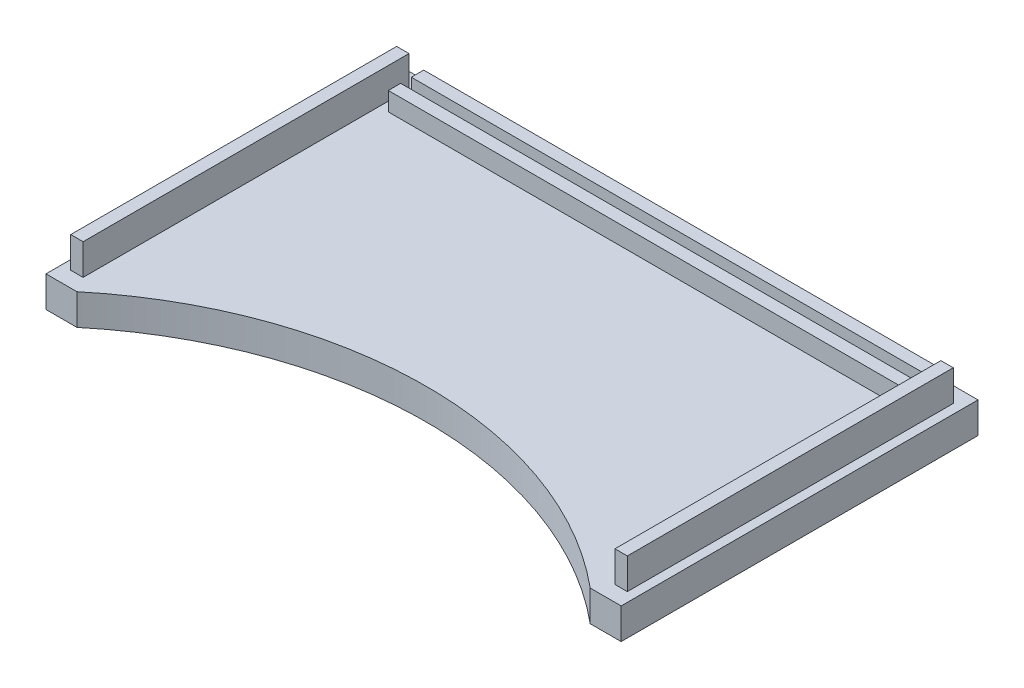
ISO-10303-21;
HEADER;
FILE_DESCRIPTION(('STEP AP214'),'2;1');
FILE_NAME('part.step','',(''),(''),'','','');
FILE_SCHEMA(('AUTOMOTIVE_DESIGN { 1 0 10303 214 1 1 1 1 }'));
ENDSEC;
DATA;
#1=APPLICATION_CONTEXT('core data for automotive mechanical design processes');
#2=APPLICATION_PROTOCOL_DEFINITION('international standard','automotive_design',2000,#1);
#3=PRODUCT_CONTEXT('',#1,'mechanical');
#4=PRODUCT('Part','Part','',(#3));
#5=PRODUCT_RELATED_PRODUCT_CATEGORY('part','',(#4));
#6=PRODUCT_DEFINITION_FORMATION('','',#4);
#7=PRODUCT_DEFINITION_CONTEXT('part definition',#1,'design');
#8=PRODUCT_DEFINITION('design','',#6,#7);
#9=PRODUCT_DEFINITION_SHAPE('','',#8);
#10=(LENGTH_UNIT() NAMED_UNIT(*) SI_UNIT(.MILLI.,.METRE.));
#11=(NAMED_UNIT(*) PLANE_ANGLE_UNIT() SI_UNIT($,.RADIAN.));
#12=(NAMED_UNIT(*) SI_UNIT($,.STERADIAN.) SOLID_ANGLE_UNIT());
#13=UNCERTAINTY_MEASURE_WITH_UNIT(LENGTH_MEASURE(1.E-05),#10,'distance_accuracy_value','');
#14=(GEOMETRIC_REPRESENTATION_CONTEXT(3) GLOBAL_UNCERTAINTY_ASSIGNED_CONTEXT((#13)) GLOBAL_UNIT_ASSIGNED_CONTEXT((#10,
#11,#12)) REPRESENTATION_CONTEXT('',''));
#15=CARTESIAN_POINT('',(0.,0.,0.));
#16=DIRECTION('',(0.,0.,1.));
#17=DIRECTION('',(1.,0.,0.));
#18=AXIS2_PLACEMENT_3D('',#15,#16,#17);
#19=CARTESIAN_POINT('',(0.,10.,0.));
#20=DIRECTION('',(0.,-1.,0.));
#21=DIRECTION('',(0.,0.,-1.));
#22=AXIS2_PLACEMENT_3D('',#19,#20,#21);
#23=PLANE('',#22);
#24=DIRECTION('',(0.,0.,1.));
#25=VECTOR('',#24,1.);
#26=CARTESIAN_POINT('',(179.,10.,-110.4));
#27=LINE('',#26,#25);
#28=CARTESIAN_POINT('',(179.,10.,-110.4));
#29=VERTEX_POINT('',#28);
#30=CARTESIAN_POINT('',(179.,10.,-5.));
#31=VERTEX_POINT('',#30);
#32=EDGE_CURVE('E205',#29,#31,#27,.T.);
#33=ORIENTED_EDGE('',*,*,#32,.F.);
#34=DIRECTION('',(-1.,0.,0.));
#35=VECTOR('',#34,1.);
#36=CARTESIAN_POINT('',(179.,10.,-110.4));
#37=LINE('',#36,#35);
#38=CARTESIAN_POINT('',(183.,10.,-110.4));
#39=VERTEX_POINT('',#38);
#40=EDGE_CURVE('E218',#39,#29,#37,.T.);
#41=ORIENTED_EDGE('',*,*,#40,.F.);
#42=DIRECTION('',(0.,0.,-1.));
#43=VECTOR('',#42,1.);
#44=CARTESIAN_POINT('',(183.,10.,-110.4));
#45=LINE('',#44,#43);
#46=CARTESIAN_POINT('',(183.,10.,-5.));
#47=VERTEX_POINT('',#46);
#48=EDGE_CURVE('E227',#47,#39,#45,.T.);
#49=ORIENTED_EDGE('',*,*,#48,.F.);
#50=DIRECTION('',(1.,0.,0.));
#51=VECTOR('',#50,1.);
#52=CARTESIAN_POINT('',(179.,10.,-5.));
#53=LINE('',#52,#51);
#54=EDGE_CURVE('E208',#31,#47,#53,.T.);
#55=ORIENTED_EDGE('',*,*,#54,.F.);
#56=EDGE_LOOP('',(#33,#41,#49,#55));
#57=FACE_BOUND('',#56,.T.);
#58=DIRECTION('',(0.,0.,1.));
#59=VECTOR('',#58,1.);
#60=CARTESIAN_POINT('',(9.99999999999991,10.,-104.7));
#61=LINE('',#60,#59);
#62=CARTESIAN_POINT('',(9.99999999999991,10.,-104.7));
#63=VERTEX_POINT('',#62);
#64=CARTESIAN_POINT('',(9.99999999999991,10.,-100.7));
#65=VERTEX_POINT('',#64);
#66=EDGE_CURVE('E276',#63,#65,#61,.T.);
#67=ORIENTED_EDGE('',*,*,#66,.F.);
#68=DIRECTION('',(-1.,0.,0.));
#69=VECTOR('',#68,1.);
#70=CARTESIAN_POINT('',(9.99999999999991,10.,-104.7));
#71=LINE('',#70,#69);
#72=CARTESIAN_POINT('',(176.,10.,-104.7));
#73=VERTEX_POINT('',#72);
#74=EDGE_CURVE('E281',#73,#63,#71,.T.);
#75=ORIENTED_EDGE('',*,*,#74,.F.);
#76=DIRECTION('',(0.,0.,-1.));
#77=VECTOR('',#76,1.);
#78=CARTESIAN_POINT('',(176.,10.,-104.7));
#79=LINE('',#78,#77);
#80=CARTESIAN_POINT('',(176.,10.,-100.7));
#81=VERTEX_POINT('',#80);
#82=EDGE_CURVE('E293',#81,#73,#79,.T.);
#83=ORIENTED_EDGE('',*,*,#82,.F.);
#84=DIRECTION('',(1.,0.,0.));
#85=VECTOR('',#84,1.);
#86=CARTESIAN_POINT('',(9.99999999999991,10.,-100.7));
#87=LINE('',#86,#85);
#88=EDGE_CURVE('E290',#65,#81,#87,.T.);
#89=ORIENTED_EDGE('',*,*,#88,.F.);
#90=EDGE_LOOP('',(#67,#75,#83,#89));
#91=FACE_BOUND('',#90,.T.);
#92=DIRECTION('',(1.,0.,0.));
#93=VECTOR('',#92,1.);
#94=CARTESIAN_POINT('',(0.,10.,0.));
#95=LINE('',#94,#93);
#96=CARTESIAN_POINT('',(0.,10.,0.));
#97=VERTEX_POINT('',#96);
#98=CARTESIAN_POINT('',(10.,10.,0.));
#99=VERTEX_POINT('',#98);
#100=EDGE_CURVE('E325',#97,#99,#95,.T.);
#101=ORIENTED_EDGE('',*,*,#100,.T.);
#102=CARTESIAN_POINT('',(93.,10.,99.8166666666667));
#103=DIRECTION('',(0.,1.,0.));
#104=DIRECTION('',(0.,0.,-1.));
#105=AXIS2_PLACEMENT_3D('',#102,#103,#104);
#106=CIRCLE('',#105,129.816666666667);
#107=CARTESIAN_POINT('',(176.,10.,0.));
#108=VERTEX_POINT('',#107);
#109=EDGE_CURVE('E309',#108,#99,#106,.T.);
#110=ORIENTED_EDGE('',*,*,#109,.F.);
#111=CARTESIAN_POINT('',(186.,10.,0.));
#112=VERTEX_POINT('',#111);
#113=EDGE_CURVE('E323',#108,#112,#95,.T.);
#114=ORIENTED_EDGE('',*,*,#113,.T.);
#115=DIRECTION('',(0.,0.,-1.));
#116=VECTOR('',#115,1.);
#117=CARTESIAN_POINT('',(186.,10.,0.));
#118=LINE('',#117,#116);
#119=CARTESIAN_POINT('',(186.,10.,-115.4));
#120=VERTEX_POINT('',#119);
#121=EDGE_CURVE('E328',#112,#120,#118,.T.);
#122=ORIENTED_EDGE('',*,*,#121,.T.);
#123=DIRECTION('',(-1.,0.,0.));
#124=VECTOR('',#123,1.);
#125=CARTESIAN_POINT('',(0.,10.,-115.4));
#126=LINE('',#125,#124);
#127=CARTESIAN_POINT('',(0.,10.,-115.4));
#128=VERTEX_POINT('',#127);
#129=EDGE_CURVE('E330',#120,#128,#126,.T.);
#130=ORIENTED_EDGE('',*,*,#129,.T.);
#131=DIRECTION('',(0.,0.,1.));
#132=VECTOR('',#131,1.);
#133=CARTESIAN_POINT('',(0.,10.,0.));
#134=LINE('',#133,#132);
#135=EDGE_CURVE('E320',#128,#97,#134,.T.);
#136=ORIENTED_EDGE('',*,*,#135,.T.);
#137=EDGE_LOOP('',(#101,#110,#114,#122,#130,#136));
#138=FACE_BOUND('',#137,.T.);
#139=DIRECTION('',(0.,0.,1.));
#140=VECTOR('',#139,1.);
#141=CARTESIAN_POINT('',(9.99999999999988,10.,-112.14));
#142=LINE('',#141,#140);
#143=CARTESIAN_POINT('',(9.99999999999988,10.,-112.14));
#144=VERTEX_POINT('',#143);
#145=CARTESIAN_POINT('',(9.99999999999988,10.,-108.14));
#146=VERTEX_POINT('',#145);
#147=EDGE_CURVE('E243',#144,#146,#142,.T.);
#148=ORIENTED_EDGE('',*,*,#147,.F.);
#149=DIRECTION('',(-1.,0.,0.));
#150=VECTOR('',#149,1.);
#151=CARTESIAN_POINT('',(9.99999999999988,10.,-112.14));
#152=LINE('',#151,#150);
#153=CARTESIAN_POINT('',(176.,10.,-112.14));
#154=VERTEX_POINT('',#153);
#155=EDGE_CURVE('E248',#154,#144,#152,.T.);
#156=ORIENTED_EDGE('',*,*,#155,.F.);
#157=DIRECTION('',(0.,0.,-1.));
#158=VECTOR('',#157,1.);
#159=CARTESIAN_POINT('',(176.,10.,-112.14));
#160=LINE('',#159,#158);
#161=CARTESIAN_POINT('',(176.,10.,-108.14));
#162=VERTEX_POINT('',#161);
#163=EDGE_CURVE('E260',#162,#154,#160,.T.);
#164=ORIENTED_EDGE('',*,*,#163,.F.);
#165=DIRECTION('',(1.,0.,0.));
#166=VECTOR('',#165,1.);
#167=CARTESIAN_POINT('',(9.99999999999988,10.,-108.14));
#168=LINE('',#167,#166);
#169=EDGE_CURVE('E257',#146,#162,#168,.T.);
#170=ORIENTED_EDGE('',*,*,#169,.F.);
#171=EDGE_LOOP('',(#148,#156,#164,#170));
#172=FACE_BOUND('',#171,.T.);
#173=DIRECTION('',(0.,0.,1.));
#174=VECTOR('',#173,1.);
#175=CARTESIAN_POINT('',(2.99999999999992,10.,-110.4));
#176=LINE('',#175,#174);
#177=CARTESIAN_POINT('',(2.99999999999992,10.,-110.4));
#178=VERTEX_POINT('',#177);
#179=CARTESIAN_POINT('',(3.00000000000002,10.,-5.));
#180=VERTEX_POINT('',#179);
#181=EDGE_CURVE('E204',#178,#180,#176,.T.);
#182=ORIENTED_EDGE('',*,*,#181,.F.);
#183=DIRECTION('',(-1.,0.,0.));
#184=VECTOR('',#183,1.);
#185=CARTESIAN_POINT('',(2.99999999999992,10.,-110.4));
#186=LINE('',#185,#184);
#187=CARTESIAN_POINT('',(6.99999999999992,10.,-110.4));
#188=VERTEX_POINT('',#187);
#189=EDGE_CURVE('E201',#188,#178,#186,.T.);
#190=ORIENTED_EDGE('',*,*,#189,.F.);
#191=DIRECTION('',(0.,0.,-1.));
#192=VECTOR('',#191,1.);
#193=CARTESIAN_POINT('',(6.99999999999992,10.,-110.4));
#194=LINE('',#193,#192);
#195=CARTESIAN_POINT('',(7.00000000000002,10.,-5.));
#196=VERTEX_POINT('',#195);
#197=EDGE_CURVE('E55',#196,#188,#194,.T.);
#198=ORIENTED_EDGE('',*,*,#197,.F.);
#199=DIRECTION('',(1.,0.,0.));
#200=VECTOR('',#199,1.);
#201=CARTESIAN_POINT('',(3.00000000000002,10.,-5.));
#202=LINE('',#201,#200);
#203=EDGE_CURVE('E50',#180,#196,#202,.T.);
#204=ORIENTED_EDGE('',*,*,#203,.F.);
#205=EDGE_LOOP('',(#182,#190,#198,#204));
#206=FACE_BOUND('',#205,.T.);
#207=ADVANCED_FACE('F35',(#57,#91,#138,#172,#206),#23,.F.);
#208=CARTESIAN_POINT('',(0.,10.,0.));
#209=DIRECTION('',(0.,0.,-1.));
#210=DIRECTION('',(-1.,0.,0.));
#211=AXIS2_PLACEMENT_3D('',#208,#209,#210);
#212=PLANE('',#211);
#213=DIRECTION('',(1.,0.,0.));
#214=VECTOR('',#213,1.);
#215=CARTESIAN_POINT('',(0.,0.,0.));
#216=LINE('',#215,#214);
#217=CARTESIAN_POINT('',(0.,0.,0.));
#218=VERTEX_POINT('',#217);
#219=CARTESIAN_POINT('',(10.,0.,0.));
#220=VERTEX_POINT('',#219);
#221=EDGE_CURVE('E336',#218,#220,#216,.T.);
#222=ORIENTED_EDGE('',*,*,#221,.T.);
#223=DIRECTION('',(0.,1.,0.));
#224=VECTOR('',#223,1.);
#225=CARTESIAN_POINT('',(10.,0.,0.));
#226=LINE('',#225,#224);
#227=EDGE_CURVE('E313',#220,#99,#226,.T.);
#228=ORIENTED_EDGE('',*,*,#227,.T.);
#229=ORIENTED_EDGE('',*,*,#100,.F.);
#230=DIRECTION('',(0.,-1.,0.));
#231=VECTOR('',#230,1.);
#232=CARTESIAN_POINT('',(0.,10.,0.));
#233=LINE('',#232,#231);
#234=EDGE_CURVE('E11',#97,#218,#233,.T.);
#235=ORIENTED_EDGE('',*,*,#234,.T.);
#236=EDGE_LOOP('',(#222,#228,#229,#235));
#237=FACE_BOUND('',#236,.T.);
#238=ADVANCED_FACE('F375',(#237),#212,.F.);
#239=CARTESIAN_POINT('',(0.,10.,0.));
#240=DIRECTION('',(1.,0.,0.));
#241=DIRECTION('',(0.,0.,-1.));
#242=AXIS2_PLACEMENT_3D('',#239,#240,#241);
#243=PLANE('',#242);
#244=DIRECTION('',(0.,0.,1.));
#245=VECTOR('',#244,1.);
#246=CARTESIAN_POINT('',(0.,0.,0.));
#247=LINE('',#246,#245);
#248=CARTESIAN_POINT('',(0.,0.,-115.4));
#249=VERTEX_POINT('',#248);
#250=EDGE_CURVE('E317',#249,#218,#247,.T.);
#251=ORIENTED_EDGE('',*,*,#250,.T.);
#252=ORIENTED_EDGE('',*,*,#234,.F.);
#253=ORIENTED_EDGE('',*,*,#135,.F.);
#254=DIRECTION('',(0.,-1.,0.));
#255=VECTOR('',#254,1.);
#256=CARTESIAN_POINT('',(0.,10.,-115.4));
#257=LINE('',#256,#255);
#258=EDGE_CURVE('E332',#128,#249,#257,.T.);
#259=ORIENTED_EDGE('',*,*,#258,.T.);
#260=EDGE_LOOP('',(#251,#252,#253,#259));
#261=FACE_BOUND('',#260,.T.);
#262=ADVANCED_FACE('F37',(#261),#243,.F.);
#263=ORIENTED_EDGE('',*,*,#113,.F.);
#264=DIRECTION('',(0.,1.,0.));
#265=VECTOR('',#264,1.);
#266=CARTESIAN_POINT('',(176.,0.,0.));
#267=LINE('',#266,#265);
#268=CARTESIAN_POINT('',(176.,0.,0.));
#269=VERTEX_POINT('',#268);
#270=EDGE_CURVE('E315',#269,#108,#267,.T.);
#271=ORIENTED_EDGE('',*,*,#270,.F.);
#272=CARTESIAN_POINT('',(186.,0.,0.));
#273=VERTEX_POINT('',#272);
#274=EDGE_CURVE('E335',#269,#273,#216,.T.);
#275=ORIENTED_EDGE('',*,*,#274,.T.);
#276=DIRECTION('',(0.,-1.,0.));
#277=VECTOR('',#276,1.);
#278=CARTESIAN_POINT('',(186.,10.,0.));
#279=LINE('',#278,#277);
#280=EDGE_CURVE('E43',#112,#273,#279,.T.);
#281=ORIENTED_EDGE('',*,*,#280,.F.);
#282=EDGE_LOOP('',(#263,#271,#275,#281));
#283=FACE_BOUND('',#282,.T.);
#284=ADVANCED_FACE('F371',(#283),#212,.F.);
#285=CARTESIAN_POINT('',(186.,10.,0.));
#286=DIRECTION('',(-1.,0.,0.));
#287=DIRECTION('',(0.,0.,1.));
#288=AXIS2_PLACEMENT_3D('',#285,#286,#287);
#289=PLANE('',#288);
#290=DIRECTION('',(0.,0.,-1.));
#291=VECTOR('',#290,1.);
#292=CARTESIAN_POINT('',(186.,0.,0.));
#293=LINE('',#292,#291);
#294=CARTESIAN_POINT('',(186.,0.,-115.4));
#295=VERTEX_POINT('',#294);
#296=EDGE_CURVE('E339',#273,#295,#293,.T.);
#297=ORIENTED_EDGE('',*,*,#296,.T.);
#298=DIRECTION('',(0.,-1.,0.));
#299=VECTOR('',#298,1.);
#300=CARTESIAN_POINT('',(186.,10.,-115.4));
#301=LINE('',#300,#299);
#302=EDGE_CURVE('E344',#120,#295,#301,.T.);
#303=ORIENTED_EDGE('',*,*,#302,.F.);
#304=ORIENTED_EDGE('',*,*,#121,.F.);
#305=ORIENTED_EDGE('',*,*,#280,.T.);
#306=EDGE_LOOP('',(#297,#303,#304,#305));
#307=FACE_BOUND('',#306,.T.);
#308=ADVANCED_FACE('F351',(#307),#289,.F.);
#309=CARTESIAN_POINT('',(0.,10.,-115.4));
#310=DIRECTION('',(0.,0.,1.));
#311=DIRECTION('',(1.,0.,0.));
#312=AXIS2_PLACEMENT_3D('',#309,#310,#311);
#313=PLANE('',#312);
#314=DIRECTION('',(-1.,0.,0.));
#315=VECTOR('',#314,1.);
#316=CARTESIAN_POINT('',(0.,0.,-115.4));
#317=LINE('',#316,#315);
#318=EDGE_CURVE('E324',#295,#249,#317,.T.);
#319=ORIENTED_EDGE('',*,*,#318,.T.);
#320=ORIENTED_EDGE('',*,*,#258,.F.);
#321=ORIENTED_EDGE('',*,*,#129,.F.);
#322=ORIENTED_EDGE('',*,*,#302,.T.);
#323=EDGE_LOOP('',(#319,#320,#321,#322));
#324=FACE_BOUND('',#323,.T.);
#325=ADVANCED_FACE('F362',(#324),#313,.F.);
#326=CARTESIAN_POINT('',(0.,0.,0.));
#327=DIRECTION('',(0.,-1.,0.));
#328=DIRECTION('',(0.,0.,-1.));
#329=AXIS2_PLACEMENT_3D('',#326,#327,#328);
#330=PLANE('',#329);
#331=CARTESIAN_POINT('',(93.,0.,99.8166666666667));
#332=DIRECTION('',(0.,1.,0.));
#333=DIRECTION('',(0.,0.,-1.));
#334=AXIS2_PLACEMENT_3D('',#331,#332,#333);
#335=CIRCLE('',#334,129.816666666667);
#336=EDGE_CURVE('E310',#269,#220,#335,.T.);
#337=ORIENTED_EDGE('',*,*,#336,.T.);
#338=ORIENTED_EDGE('',*,*,#221,.F.);
#339=ORIENTED_EDGE('',*,*,#250,.F.);
#340=ORIENTED_EDGE('',*,*,#318,.F.);
#341=ORIENTED_EDGE('',*,*,#296,.F.);
#342=ORIENTED_EDGE('',*,*,#274,.F.);
#343=EDGE_LOOP('',(#337,#338,#339,#340,#341,#342));
#344=FACE_BOUND('',#343,.T.);
#345=ADVANCED_FACE('F358',(#344),#330,.T.);
#346=CARTESIAN_POINT('',(93.,0.,99.8166666666667));
#347=DIRECTION('',(0.,1.,0.));
#348=DIRECTION('',(0.,0.,1.));
#349=AXIS2_PLACEMENT_3D('',#346,#347,#348);
#350=CYLINDRICAL_SURFACE('',#349,129.816666666667);
#351=ORIENTED_EDGE('',*,*,#109,.T.);
#352=ORIENTED_EDGE('',*,*,#227,.F.);
#353=ORIENTED_EDGE('',*,*,#336,.F.);
#354=ORIENTED_EDGE('',*,*,#270,.T.);
#355=EDGE_LOOP('',(#351,#352,#353,#354));
#356=FACE_BOUND('',#355,.T.);
#357=ADVANCED_FACE('F373',(#356),#350,.F.);
#358=CARTESIAN_POINT('',(9.99999999999991,16.,-104.7));
#359=DIRECTION('',(1.,0.,0.));
#360=DIRECTION('',(0.,0.,-1.));
#361=AXIS2_PLACEMENT_3D('',#358,#359,#360);
#362=PLANE('',#361);
#363=ORIENTED_EDGE('',*,*,#66,.T.);
#364=DIRECTION('',(0.,-1.,0.));
#365=VECTOR('',#364,1.);
#366=CARTESIAN_POINT('',(9.99999999999991,16.,-100.7));
#367=LINE('',#366,#365);
#368=CARTESIAN_POINT('',(9.99999999999991,16.,-100.7));
#369=VERTEX_POINT('',#368);
#370=EDGE_CURVE('E306',#369,#65,#367,.T.);
#371=ORIENTED_EDGE('',*,*,#370,.F.);
#372=DIRECTION('',(0.,0.,1.));
#373=VECTOR('',#372,1.);
#374=CARTESIAN_POINT('',(9.99999999999991,16.,-104.7));
#375=LINE('',#374,#373);
#376=CARTESIAN_POINT('',(9.99999999999991,16.,-104.7));
#377=VERTEX_POINT('',#376);
#378=EDGE_CURVE('E277',#377,#369,#375,.T.);
#379=ORIENTED_EDGE('',*,*,#378,.F.);
#380=DIRECTION('',(0.,-1.,0.));
#381=VECTOR('',#380,1.);
#382=CARTESIAN_POINT('',(9.99999999999991,16.,-104.7));
#383=LINE('',#382,#381);
#384=EDGE_CURVE('E287',#377,#63,#383,.T.);
#385=ORIENTED_EDGE('',*,*,#384,.T.);
#386=EDGE_LOOP('',(#363,#371,#379,#385));
#387=FACE_BOUND('',#386,.T.);
#388=ADVANCED_FACE('F397',(#387),#362,.F.);
#389=CARTESIAN_POINT('',(9.99999999999991,16.,-100.7));
#390=DIRECTION('',(0.,0.,-1.));
#391=DIRECTION('',(-1.,0.,0.));
#392=AXIS2_PLACEMENT_3D('',#389,#390,#391);
#393=PLANE('',#392);
#394=ORIENTED_EDGE('',*,*,#88,.T.);
#395=DIRECTION('',(0.,-1.,0.));
#396=VECTOR('',#395,1.);
#397=CARTESIAN_POINT('',(176.,16.,-100.7));
#398=LINE('',#397,#396);
#399=CARTESIAN_POINT('',(176.,16.,-100.7));
#400=VERTEX_POINT('',#399);
#401=EDGE_CURVE('E303',#400,#81,#398,.T.);
#402=ORIENTED_EDGE('',*,*,#401,.F.);
#403=DIRECTION('',(1.,0.,0.));
#404=VECTOR('',#403,1.);
#405=CARTESIAN_POINT('',(9.99999999999991,16.,-100.7));
#406=LINE('',#405,#404);
#407=EDGE_CURVE('E280',#369,#400,#406,.T.);
#408=ORIENTED_EDGE('',*,*,#407,.F.);
#409=ORIENTED_EDGE('',*,*,#370,.T.);
#410=EDGE_LOOP('',(#394,#402,#408,#409));
#411=FACE_BOUND('',#410,.T.);
#412=ADVANCED_FACE('F400',(#411),#393,.F.);
#413=CARTESIAN_POINT('',(176.,16.,-104.7));
#414=DIRECTION('',(-1.,0.,0.));
#415=DIRECTION('',(0.,0.,1.));
#416=AXIS2_PLACEMENT_3D('',#413,#414,#415);
#417=PLANE('',#416);
#418=ORIENTED_EDGE('',*,*,#82,.T.);
#419=DIRECTION('',(0.,-1.,0.));
#420=VECTOR('',#419,1.);
#421=CARTESIAN_POINT('',(176.,16.,-104.7));
#422=LINE('',#421,#420);
#423=CARTESIAN_POINT('',(176.,16.,-104.7));
#424=VERTEX_POINT('',#423);
#425=EDGE_CURVE('E300',#424,#73,#422,.T.);
#426=ORIENTED_EDGE('',*,*,#425,.F.);
#427=DIRECTION('',(0.,0.,-1.));
#428=VECTOR('',#427,1.);
#429=CARTESIAN_POINT('',(176.,16.,-104.7));
#430=LINE('',#429,#428);
#431=EDGE_CURVE('E283',#400,#424,#430,.T.);
#432=ORIENTED_EDGE('',*,*,#431,.F.);
#433=ORIENTED_EDGE('',*,*,#401,.T.);
#434=EDGE_LOOP('',(#418,#426,#432,#433));
#435=FACE_BOUND('',#434,.T.);
#436=ADVANCED_FACE('F404',(#435),#417,.F.);
#437=CARTESIAN_POINT('',(9.99999999999991,16.,-104.7));
#438=DIRECTION('',(0.,0.,1.));
#439=DIRECTION('',(1.,0.,0.));
#440=AXIS2_PLACEMENT_3D('',#437,#438,#439);
#441=PLANE('',#440);
#442=ORIENTED_EDGE('',*,*,#74,.T.);
#443=ORIENTED_EDGE('',*,*,#384,.F.);
#444=DIRECTION('',(-1.,0.,0.));
#445=VECTOR('',#444,1.);
#446=CARTESIAN_POINT('',(9.99999999999991,16.,-104.7));
#447=LINE('',#446,#445);
#448=EDGE_CURVE('E285',#424,#377,#447,.T.);
#449=ORIENTED_EDGE('',*,*,#448,.F.);
#450=ORIENTED_EDGE('',*,*,#425,.T.);
#451=EDGE_LOOP('',(#442,#443,#449,#450));
#452=FACE_BOUND('',#451,.T.);
#453=ADVANCED_FACE('F408',(#452),#441,.F.);
#454=CARTESIAN_POINT('',(0.,16.,0.));
#455=DIRECTION('',(0.,1.,0.));
#456=DIRECTION('',(0.,0.,1.));
#457=AXIS2_PLACEMENT_3D('',#454,#455,#456);
#458=PLANE('',#457);
#459=ORIENTED_EDGE('',*,*,#378,.T.);
#460=ORIENTED_EDGE('',*,*,#407,.T.);
#461=ORIENTED_EDGE('',*,*,#431,.T.);
#462=ORIENTED_EDGE('',*,*,#448,.T.);
#463=EDGE_LOOP('',(#459,#460,#461,#462));
#464=FACE_BOUND('',#463,.T.);
#465=ADVANCED_FACE('F412',(#464),#458,.T.);
#466=CARTESIAN_POINT('',(9.99999999999988,16.,-112.14));
#467=DIRECTION('',(1.,0.,0.));
#468=DIRECTION('',(0.,0.,-1.));
#469=AXIS2_PLACEMENT_3D('',#466,#467,#468);
#470=PLANE('',#469);
#471=ORIENTED_EDGE('',*,*,#147,.T.);
#472=DIRECTION('',(0.,-1.,0.));
#473=VECTOR('',#472,1.);
#474=CARTESIAN_POINT('',(9.99999999999988,16.,-108.14));
#475=LINE('',#474,#473);
#476=CARTESIAN_POINT('',(9.99999999999988,16.,-108.14));
#477=VERTEX_POINT('',#476);
#478=EDGE_CURVE('E273',#477,#146,#475,.T.);
#479=ORIENTED_EDGE('',*,*,#478,.F.);
#480=DIRECTION('',(0.,0.,1.));
#481=VECTOR('',#480,1.);
#482=CARTESIAN_POINT('',(9.99999999999988,16.,-112.14));
#483=LINE('',#482,#481);
#484=CARTESIAN_POINT('',(9.99999999999988,16.,-112.14));
#485=VERTEX_POINT('',#484);
#486=EDGE_CURVE('E244',#485,#477,#483,.T.);
#487=ORIENTED_EDGE('',*,*,#486,.F.);
#488=DIRECTION('',(0.,-1.,0.));
#489=VECTOR('',#488,1.);
#490=CARTESIAN_POINT('',(9.99999999999988,16.,-112.14));
#491=LINE('',#490,#489);
#492=EDGE_CURVE('E254',#485,#144,#491,.T.);
#493=ORIENTED_EDGE('',*,*,#492,.T.);
#494=EDGE_LOOP('',(#471,#479,#487,#493));
#495=FACE_BOUND('',#494,.T.);
#496=ADVANCED_FACE('F416',(#495),#470,.F.);
#497=CARTESIAN_POINT('',(9.99999999999988,16.,-108.14));
#498=DIRECTION('',(0.,0.,-1.));
#499=DIRECTION('',(-1.,0.,0.));
#500=AXIS2_PLACEMENT_3D('',#497,#498,#499);
#501=PLANE('',#500);
#502=ORIENTED_EDGE('',*,*,#169,.T.);
#503=DIRECTION('',(0.,-1.,0.));
#504=VECTOR('',#503,1.);
#505=CARTESIAN_POINT('',(176.,16.,-108.14));
#506=LINE('',#505,#504);
#507=CARTESIAN_POINT('',(176.,16.,-108.14));
#508=VERTEX_POINT('',#507);
#509=EDGE_CURVE('E270',#508,#162,#506,.T.);
#510=ORIENTED_EDGE('',*,*,#509,.F.);
#511=DIRECTION('',(1.,0.,0.));
#512=VECTOR('',#511,1.);
#513=CARTESIAN_POINT('',(9.99999999999988,16.,-108.14));
#514=LINE('',#513,#512);
#515=EDGE_CURVE('E247',#477,#508,#514,.T.);
#516=ORIENTED_EDGE('',*,*,#515,.F.);
#517=ORIENTED_EDGE('',*,*,#478,.T.);
#518=EDGE_LOOP('',(#502,#510,#516,#517));
#519=FACE_BOUND('',#518,.T.);
#520=ADVANCED_FACE('F420',(#519),#501,.F.);
#521=CARTESIAN_POINT('',(176.,16.,-112.14));
#522=DIRECTION('',(-1.,0.,0.));
#523=DIRECTION('',(0.,0.,1.));
#524=AXIS2_PLACEMENT_3D('',#521,#522,#523);
#525=PLANE('',#524);
#526=ORIENTED_EDGE('',*,*,#163,.T.);
#527=DIRECTION('',(0.,-1.,0.));
#528=VECTOR('',#527,1.);
#529=CARTESIAN_POINT('',(176.,16.,-112.14));
#530=LINE('',#529,#528);
#531=CARTESIAN_POINT('',(176.,16.,-112.14));
#532=VERTEX_POINT('',#531);
#533=EDGE_CURVE('E267',#532,#154,#530,.T.);
#534=ORIENTED_EDGE('',*,*,#533,.F.);
#535=DIRECTION('',(0.,0.,-1.));
#536=VECTOR('',#535,1.);
#537=CARTESIAN_POINT('',(176.,16.,-112.14));
#538=LINE('',#537,#536);
#539=EDGE_CURVE('E250',#508,#532,#538,.T.);
#540=ORIENTED_EDGE('',*,*,#539,.F.);
#541=ORIENTED_EDGE('',*,*,#509,.T.);
#542=EDGE_LOOP('',(#526,#534,#540,#541));
#543=FACE_BOUND('',#542,.T.);
#544=ADVANCED_FACE('F424',(#543),#525,.F.);
#545=CARTESIAN_POINT('',(9.99999999999988,16.,-112.14));
#546=DIRECTION('',(0.,0.,1.));
#547=DIRECTION('',(1.,0.,0.));
#548=AXIS2_PLACEMENT_3D('',#545,#546,#547);
#549=PLANE('',#548);
#550=ORIENTED_EDGE('',*,*,#155,.T.);
#551=ORIENTED_EDGE('',*,*,#492,.F.);
#552=DIRECTION('',(-1.,0.,0.));
#553=VECTOR('',#552,1.);
#554=CARTESIAN_POINT('',(9.99999999999988,16.,-112.14));
#555=LINE('',#554,#553);
#556=EDGE_CURVE('E252',#532,#485,#555,.T.);
#557=ORIENTED_EDGE('',*,*,#556,.F.);
#558=ORIENTED_EDGE('',*,*,#533,.T.);
#559=EDGE_LOOP('',(#550,#551,#557,#558));
#560=FACE_BOUND('',#559,.T.);
#561=ADVANCED_FACE('F428',(#560),#549,.F.);
#562=CARTESIAN_POINT('',(0.,16.,0.));
#563=DIRECTION('',(0.,1.,0.));
#564=DIRECTION('',(0.,0.,1.));
#565=AXIS2_PLACEMENT_3D('',#562,#563,#564);
#566=PLANE('',#565);
#567=ORIENTED_EDGE('',*,*,#486,.T.);
#568=ORIENTED_EDGE('',*,*,#515,.T.);
#569=ORIENTED_EDGE('',*,*,#539,.T.);
#570=ORIENTED_EDGE('',*,*,#556,.T.);
#571=EDGE_LOOP('',(#567,#568,#569,#570));
#572=FACE_BOUND('',#571,.T.);
#573=ADVANCED_FACE('F432',(#572),#566,.T.);
#574=CARTESIAN_POINT('',(179.,20.,-110.4));
#575=DIRECTION('',(1.,0.,0.));
#576=DIRECTION('',(0.,0.,-1.));
#577=AXIS2_PLACEMENT_3D('',#574,#575,#576);
#578=PLANE('',#577);
#579=ORIENTED_EDGE('',*,*,#32,.T.);
#580=DIRECTION('',(0.,-1.,0.));
#581=VECTOR('',#580,1.);
#582=CARTESIAN_POINT('',(179.,20.,-5.));
#583=LINE('',#582,#581);
#584=CARTESIAN_POINT('',(179.,20.,-5.));
#585=VERTEX_POINT('',#584);
#586=EDGE_CURVE('E240',#585,#31,#583,.T.);
#587=ORIENTED_EDGE('',*,*,#586,.F.);
#588=DIRECTION('',(0.,0.,1.));
#589=VECTOR('',#588,1.);
#590=CARTESIAN_POINT('',(179.,20.,-110.4));
#591=LINE('',#590,#589);
#592=CARTESIAN_POINT('',(179.,20.,-110.4));
#593=VERTEX_POINT('',#592);
#594=EDGE_CURVE('E214',#593,#585,#591,.T.);
#595=ORIENTED_EDGE('',*,*,#594,.F.);
#596=DIRECTION('',(0.,-1.,0.));
#597=VECTOR('',#596,1.);
#598=CARTESIAN_POINT('',(179.,20.,-110.4));
#599=LINE('',#598,#597);
#600=EDGE_CURVE('E223',#593,#29,#599,.T.);
#601=ORIENTED_EDGE('',*,*,#600,.T.);
#602=EDGE_LOOP('',(#579,#587,#595,#601));
#603=FACE_BOUND('',#602,.T.);
#604=ADVANCED_FACE('F436',(#603),#578,.F.);
#605=CARTESIAN_POINT('',(179.,20.,-5.));
#606=DIRECTION('',(0.,0.,-1.));
#607=DIRECTION('',(-1.,0.,0.));
#608=AXIS2_PLACEMENT_3D('',#605,#606,#607);
#609=PLANE('',#608);
#610=ORIENTED_EDGE('',*,*,#54,.T.);
#611=DIRECTION('',(0.,-1.,0.));
#612=VECTOR('',#611,1.);
#613=CARTESIAN_POINT('',(183.,20.,-5.));
#614=LINE('',#613,#612);
#615=CARTESIAN_POINT('',(183.,20.,-5.));
#616=VERTEX_POINT('',#615);
#617=EDGE_CURVE('E237',#616,#47,#614,.T.);
#618=ORIENTED_EDGE('',*,*,#617,.F.);
#619=DIRECTION('',(1.,0.,0.));
#620=VECTOR('',#619,1.);
#621=CARTESIAN_POINT('',(179.,20.,-5.));
#622=LINE('',#621,#620);
#623=EDGE_CURVE('E217',#585,#616,#622,.T.);
#624=ORIENTED_EDGE('',*,*,#623,.F.);
#625=ORIENTED_EDGE('',*,*,#586,.T.);
#626=EDGE_LOOP('',(#610,#618,#624,#625));
#627=FACE_BOUND('',#626,.T.);
#628=ADVANCED_FACE('F440',(#627),#609,.F.);
#629=CARTESIAN_POINT('',(183.,20.,-110.4));
#630=DIRECTION('',(-1.,0.,0.));
#631=DIRECTION('',(0.,0.,1.));
#632=AXIS2_PLACEMENT_3D('',#629,#630,#631);
#633=PLANE('',#632);
#634=ORIENTED_EDGE('',*,*,#48,.T.);
#635=DIRECTION('',(0.,-1.,0.));
#636=VECTOR('',#635,1.);
#637=CARTESIAN_POINT('',(183.,20.,-110.4));
#638=LINE('',#637,#636);
#639=CARTESIAN_POINT('',(183.,20.,-110.4));
#640=VERTEX_POINT('',#639);
#641=EDGE_CURVE('E234',#640,#39,#638,.T.);
#642=ORIENTED_EDGE('',*,*,#641,.F.);
#643=DIRECTION('',(0.,0.,-1.));
#644=VECTOR('',#643,1.);
#645=CARTESIAN_POINT('',(183.,20.,-110.4));
#646=LINE('',#645,#644);
#647=EDGE_CURVE('E220',#616,#640,#646,.T.);
#648=ORIENTED_EDGE('',*,*,#647,.F.);
#649=ORIENTED_EDGE('',*,*,#617,.T.);
#650=EDGE_LOOP('',(#634,#642,#648,#649));
#651=FACE_BOUND('',#650,.T.);
#652=ADVANCED_FACE('F444',(#651),#633,.F.);
#653=CARTESIAN_POINT('',(179.,20.,-110.4));
#654=DIRECTION('',(0.,0.,1.));
#655=DIRECTION('',(1.,0.,0.));
#656=AXIS2_PLACEMENT_3D('',#653,#654,#655);
#657=PLANE('',#656);
#658=ORIENTED_EDGE('',*,*,#40,.T.);
#659=ORIENTED_EDGE('',*,*,#600,.F.);
#660=DIRECTION('',(-1.,0.,0.));
#661=VECTOR('',#660,1.);
#662=CARTESIAN_POINT('',(179.,20.,-110.4));
#663=LINE('',#662,#661);
#664=EDGE_CURVE('E222',#640,#593,#663,.T.);
#665=ORIENTED_EDGE('',*,*,#664,.F.);
#666=ORIENTED_EDGE('',*,*,#641,.T.);
#667=EDGE_LOOP('',(#658,#659,#665,#666));
#668=FACE_BOUND('',#667,.T.);
#669=ADVANCED_FACE('F448',(#668),#657,.F.);
#670=CARTESIAN_POINT('',(0.,20.,0.));
#671=DIRECTION('',(0.,1.,0.));
#672=DIRECTION('',(0.,0.,1.));
#673=AXIS2_PLACEMENT_3D('',#670,#671,#672);
#674=PLANE('',#673);
#675=ORIENTED_EDGE('',*,*,#594,.T.);
#676=ORIENTED_EDGE('',*,*,#623,.T.);
#677=ORIENTED_EDGE('',*,*,#647,.T.);
#678=ORIENTED_EDGE('',*,*,#664,.T.);
#679=EDGE_LOOP('',(#675,#676,#677,#678));
#680=FACE_BOUND('',#679,.T.);
#681=ADVANCED_FACE('F452',(#680),#674,.T.);
#682=CARTESIAN_POINT('',(2.99999999999992,20.,-110.4));
#683=DIRECTION('',(1.,0.,0.));
#684=DIRECTION('',(0.,0.,-1.));
#685=AXIS2_PLACEMENT_3D('',#682,#683,#684);
#686=PLANE('',#685);
#687=ORIENTED_EDGE('',*,*,#181,.T.);
#688=DIRECTION('',(0.,-1.,0.));
#689=VECTOR('',#688,1.);
#690=CARTESIAN_POINT('',(3.00000000000002,20.,-5.));
#691=LINE('',#690,#689);
#692=CARTESIAN_POINT('',(3.00000000000002,20.,-5.));
#693=VERTEX_POINT('',#692);
#694=EDGE_CURVE('E185',#693,#180,#691,.T.);
#695=ORIENTED_EDGE('',*,*,#694,.F.);
#696=DIRECTION('',(0.,0.,1.));
#697=VECTOR('',#696,1.);
#698=CARTESIAN_POINT('',(2.99999999999992,20.,-110.4));
#699=LINE('',#698,#697);
#700=CARTESIAN_POINT('',(2.99999999999992,20.,-110.4));
#701=VERTEX_POINT('',#700);
#702=EDGE_CURVE('E192',#701,#693,#699,.T.);
#703=ORIENTED_EDGE('',*,*,#702,.F.);
#704=DIRECTION('',(0.,-1.,0.));
#705=VECTOR('',#704,1.);
#706=CARTESIAN_POINT('',(2.99999999999992,20.,-110.4));
#707=LINE('',#706,#705);
#708=EDGE_CURVE('E634',#701,#178,#707,.T.);
#709=ORIENTED_EDGE('',*,*,#708,.T.);
#710=EDGE_LOOP('',(#687,#695,#703,#709));
#711=FACE_BOUND('',#710,.T.);
#712=ADVANCED_FACE('F203',(#711),#686,.F.);
#713=CARTESIAN_POINT('',(3.00000000000002,20.,-5.));
#714=DIRECTION('',(0.,0.,-1.));
#715=DIRECTION('',(-1.,0.,0.));
#716=AXIS2_PLACEMENT_3D('',#713,#714,#715);
#717=PLANE('',#716);
#718=ORIENTED_EDGE('',*,*,#203,.T.);
#719=DIRECTION('',(0.,-1.,0.));
#720=VECTOR('',#719,1.);
#721=CARTESIAN_POINT('',(7.00000000000002,20.,-5.));
#722=LINE('',#721,#720);
#723=CARTESIAN_POINT('',(7.00000000000002,20.,-5.));
#724=VERTEX_POINT('',#723);
#725=EDGE_CURVE('E188',#724,#196,#722,.T.);
#726=ORIENTED_EDGE('',*,*,#725,.F.);
#727=DIRECTION('',(1.,0.,0.));
#728=VECTOR('',#727,1.);
#729=CARTESIAN_POINT('',(3.00000000000002,20.,-5.));
#730=LINE('',#729,#728);
#731=EDGE_CURVE('E181',#693,#724,#730,.T.);
#732=ORIENTED_EDGE('',*,*,#731,.F.);
#733=ORIENTED_EDGE('',*,*,#694,.T.);
#734=EDGE_LOOP('',(#718,#726,#732,#733));
#735=FACE_BOUND('',#734,.T.);
#736=ADVANCED_FACE('F183',(#735),#717,.F.);
#737=CARTESIAN_POINT('',(6.99999999999992,20.,-110.4));
#738=DIRECTION('',(-1.,0.,0.));
#739=DIRECTION('',(0.,0.,1.));
#740=AXIS2_PLACEMENT_3D('',#737,#738,#739);
#741=PLANE('',#740);
#742=ORIENTED_EDGE('',*,*,#197,.T.);
#743=DIRECTION('',(0.,-1.,0.));
#744=VECTOR('',#743,1.);
#745=CARTESIAN_POINT('',(6.99999999999992,20.,-110.4));
#746=LINE('',#745,#744);
#747=CARTESIAN_POINT('',(6.99999999999992,20.,-110.4));
#748=VERTEX_POINT('',#747);
#749=EDGE_CURVE('E210',#748,#188,#746,.T.);
#750=ORIENTED_EDGE('',*,*,#749,.F.);
#751=DIRECTION('',(0.,0.,-1.));
#752=VECTOR('',#751,1.);
#753=CARTESIAN_POINT('',(6.99999999999992,20.,-110.4));
#754=LINE('',#753,#752);
#755=EDGE_CURVE('E191',#724,#748,#754,.T.);
#756=ORIENTED_EDGE('',*,*,#755,.F.);
#757=ORIENTED_EDGE('',*,*,#725,.T.);
#758=EDGE_LOOP('',(#742,#750,#756,#757));
#759=FACE_BOUND('',#758,.T.);
#760=ADVANCED_FACE('F461',(#759),#741,.F.);
#761=CARTESIAN_POINT('',(2.99999999999992,20.,-110.4));
#762=DIRECTION('',(0.,0.,1.));
#763=DIRECTION('',(1.,0.,0.));
#764=AXIS2_PLACEMENT_3D('',#761,#762,#763);
#765=PLANE('',#764);
#766=ORIENTED_EDGE('',*,*,#189,.T.);
#767=ORIENTED_EDGE('',*,*,#708,.F.);
#768=DIRECTION('',(-1.,0.,0.));
#769=VECTOR('',#768,1.);
#770=CARTESIAN_POINT('',(2.99999999999992,20.,-110.4));
#771=LINE('',#770,#769);
#772=EDGE_CURVE('E197',#748,#701,#771,.T.);
#773=ORIENTED_EDGE('',*,*,#772,.F.);
#774=ORIENTED_EDGE('',*,*,#749,.T.);
#775=EDGE_LOOP('',(#766,#767,#773,#774));
#776=FACE_BOUND('',#775,.T.);
#777=ADVANCED_FACE('F464',(#776),#765,.F.);
#778=CARTESIAN_POINT('',(0.,20.,0.));
#779=DIRECTION('',(0.,1.,0.));
#780=DIRECTION('',(0.,0.,1.));
#781=AXIS2_PLACEMENT_3D('',#778,#779,#780);
#782=PLANE('',#781);
#783=ORIENTED_EDGE('',*,*,#702,.T.);
#784=ORIENTED_EDGE('',*,*,#731,.T.);
#785=ORIENTED_EDGE('',*,*,#755,.T.);
#786=ORIENTED_EDGE('',*,*,#772,.T.);
#787=EDGE_LOOP('',(#783,#784,#785,#786));
#788=FACE_BOUND('',#787,.T.);
#789=ADVANCED_FACE('F195',(#788),#782,.T.);
#790=CLOSED_SHELL('',(#207,#238,#262,#284,#308,#325,#345,#357,#388,#412,#436,#453,#465,#496,
#520,#544,#561,#573,#604,#628,#652,#669,#681,#712,#736,#760,#777,#789));
#791=MANIFOLD_SOLID_BREP('B2',#790);
#792=ADVANCED_BREP_SHAPE_REPRESENTATION('',(#18,#791),#14);
#793=SHAPE_DEFINITION_REPRESENTATION(#9,#792);
ENDSEC;
END-ISO-10303-21;
